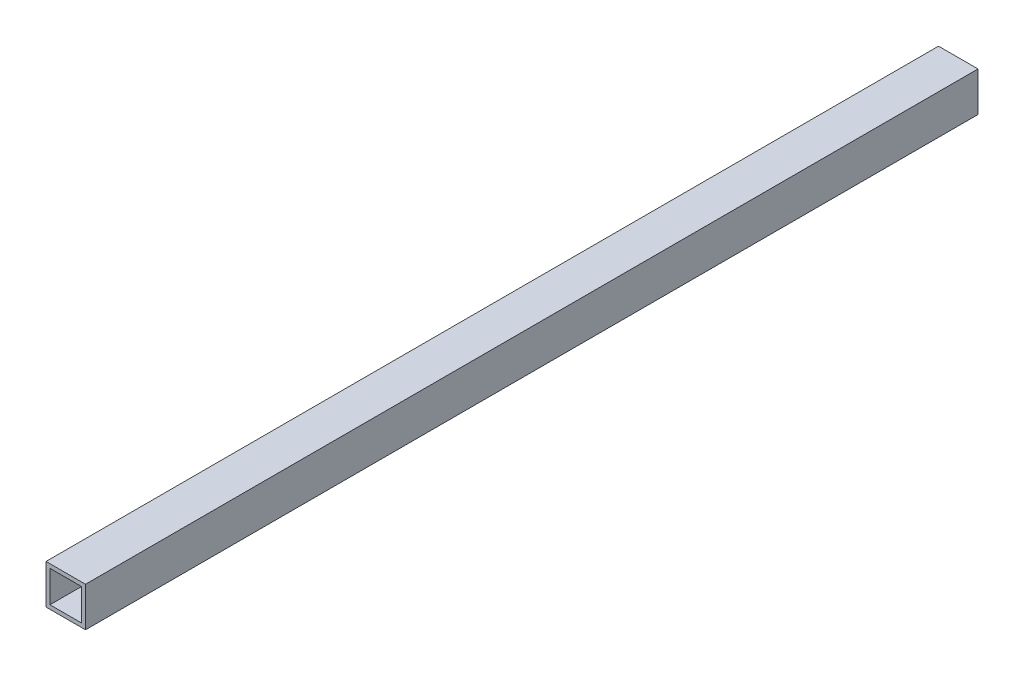
ISO-10303-21;
HEADER;
FILE_DESCRIPTION(('STEP AP214'),'2;1');
FILE_NAME('part.step','',(''),(''),'','','');
FILE_SCHEMA(('AUTOMOTIVE_DESIGN { 1 0 10303 214 1 1 1 1 }'));
ENDSEC;
DATA;
#1=APPLICATION_CONTEXT('core data for automotive mechanical design processes');
#2=APPLICATION_PROTOCOL_DEFINITION('international standard','automotive_design',2000,#1);
#3=PRODUCT_CONTEXT('',#1,'mechanical');
#4=PRODUCT('Part','Part','',(#3));
#5=PRODUCT_RELATED_PRODUCT_CATEGORY('part','',(#4));
#6=PRODUCT_DEFINITION_FORMATION('','',#4);
#7=PRODUCT_DEFINITION_CONTEXT('part definition',#1,'design');
#8=PRODUCT_DEFINITION('design','',#6,#7);
#9=PRODUCT_DEFINITION_SHAPE('','',#8);
#10=(LENGTH_UNIT() NAMED_UNIT(*) SI_UNIT(.MILLI.,.METRE.));
#11=(NAMED_UNIT(*) PLANE_ANGLE_UNIT() SI_UNIT($,.RADIAN.));
#12=(NAMED_UNIT(*) SI_UNIT($,.STERADIAN.) SOLID_ANGLE_UNIT());
#13=UNCERTAINTY_MEASURE_WITH_UNIT(LENGTH_MEASURE(1.E-05),#10,'distance_accuracy_value','');
#14=(GEOMETRIC_REPRESENTATION_CONTEXT(3) GLOBAL_UNCERTAINTY_ASSIGNED_CONTEXT((#13)) GLOBAL_UNIT_ASSIGNED_CONTEXT((#10,
#11,#12)) REPRESENTATION_CONTEXT('',''));
#15=CARTESIAN_POINT('',(0.,0.,0.));
#16=DIRECTION('',(0.,0.,1.));
#17=DIRECTION('',(1.,0.,0.));
#18=AXIS2_PLACEMENT_3D('',#15,#16,#17);
#19=CARTESIAN_POINT('',(0.,0.,226.));
#20=DIRECTION('',(0.,0.,1.));
#21=DIRECTION('',(1.,0.,0.));
#22=AXIS2_PLACEMENT_3D('',#19,#20,#21);
#23=PLANE('',#22);
#24=DIRECTION('',(0.,-1.,0.));
#25=VECTOR('',#24,1.);
#26=CARTESIAN_POINT('',(-10.,10.,226.));
#27=LINE('',#26,#25);
#28=CARTESIAN_POINT('',(-10.,10.,226.));
#29=VERTEX_POINT('',#28);
#30=CARTESIAN_POINT('',(-10.,-10.,226.));
#31=VERTEX_POINT('',#30);
#32=EDGE_CURVE('E161',#29,#31,#27,.T.);
#33=ORIENTED_EDGE('',*,*,#32,.T.);
#34=DIRECTION('',(1.,0.,0.));
#35=VECTOR('',#34,1.);
#36=CARTESIAN_POINT('',(-10.,-10.,226.));
#37=LINE('',#36,#35);
#38=CARTESIAN_POINT('',(10.,-10.,226.));
#39=VERTEX_POINT('',#38);
#40=EDGE_CURVE('E165',#31,#39,#37,.T.);
#41=ORIENTED_EDGE('',*,*,#40,.T.);
#42=DIRECTION('',(0.,1.,0.));
#43=VECTOR('',#42,1.);
#44=CARTESIAN_POINT('',(10.,10.,226.));
#45=LINE('',#44,#43);
#46=CARTESIAN_POINT('',(10.,10.,226.));
#47=VERTEX_POINT('',#46);
#48=EDGE_CURVE('E169',#39,#47,#45,.T.);
#49=ORIENTED_EDGE('',*,*,#48,.T.);
#50=DIRECTION('',(-1.,0.,0.));
#51=VECTOR('',#50,1.);
#52=CARTESIAN_POINT('',(-10.,10.,226.));
#53=LINE('',#52,#51);
#54=EDGE_CURVE('E172',#47,#29,#53,.T.);
#55=ORIENTED_EDGE('',*,*,#54,.T.);
#56=EDGE_LOOP('',(#33,#41,#49,#55));
#57=FACE_BOUND('',#56,.T.);
#58=DIRECTION('',(0.,-1.,0.));
#59=VECTOR('',#58,1.);
#60=CARTESIAN_POINT('',(-8.,8.,226.));
#61=LINE('',#60,#59);
#62=CARTESIAN_POINT('',(-8.,8.,226.));
#63=VERTEX_POINT('',#62);
#64=CARTESIAN_POINT('',(-8.,-8.,226.));
#65=VERTEX_POINT('',#64);
#66=EDGE_CURVE('E122',#63,#65,#61,.T.);
#67=ORIENTED_EDGE('',*,*,#66,.F.);
#68=DIRECTION('',(-1.,0.,0.));
#69=VECTOR('',#68,1.);
#70=CARTESIAN_POINT('',(-8.,8.,226.));
#71=LINE('',#70,#69);
#72=CARTESIAN_POINT('',(8.,8.,226.));
#73=VERTEX_POINT('',#72);
#74=EDGE_CURVE('E113',#73,#63,#71,.T.);
#75=ORIENTED_EDGE('',*,*,#74,.F.);
#76=DIRECTION('',(0.,1.,0.));
#77=VECTOR('',#76,1.);
#78=CARTESIAN_POINT('',(8.,8.,226.));
#79=LINE('',#78,#77);
#80=CARTESIAN_POINT('',(8.,-8.,226.));
#81=VERTEX_POINT('',#80);
#82=EDGE_CURVE('E139',#81,#73,#79,.T.);
#83=ORIENTED_EDGE('',*,*,#82,.F.);
#84=DIRECTION('',(1.,0.,0.));
#85=VECTOR('',#84,1.);
#86=CARTESIAN_POINT('',(-8.,-8.,226.));
#87=LINE('',#86,#85);
#88=EDGE_CURVE('E135',#65,#81,#87,.T.);
#89=ORIENTED_EDGE('',*,*,#88,.F.);
#90=EDGE_LOOP('',(#67,#75,#83,#89));
#91=FACE_BOUND('',#90,.T.);
#92=ADVANCED_FACE('F47',(#57,#91),#23,.T.);
#93=CARTESIAN_POINT('',(0.,0.,-226.));
#94=DIRECTION('',(0.,0.,1.));
#95=DIRECTION('',(1.,0.,0.));
#96=AXIS2_PLACEMENT_3D('',#93,#94,#95);
#97=PLANE('',#96);
#98=DIRECTION('',(0.,-1.,0.));
#99=VECTOR('',#98,1.);
#100=CARTESIAN_POINT('',(-10.,10.,-226.));
#101=LINE('',#100,#99);
#102=CARTESIAN_POINT('',(-10.,10.,-226.));
#103=VERTEX_POINT('',#102);
#104=CARTESIAN_POINT('',(-10.,-10.,-226.));
#105=VERTEX_POINT('',#104);
#106=EDGE_CURVE('E131',#103,#105,#101,.T.);
#107=ORIENTED_EDGE('',*,*,#106,.F.);
#108=DIRECTION('',(-1.,0.,0.));
#109=VECTOR('',#108,1.);
#110=CARTESIAN_POINT('',(-10.,10.,-226.));
#111=LINE('',#110,#109);
#112=CARTESIAN_POINT('',(10.,10.,-226.));
#113=VERTEX_POINT('',#112);
#114=EDGE_CURVE('E166',#113,#103,#111,.T.);
#115=ORIENTED_EDGE('',*,*,#114,.F.);
#116=DIRECTION('',(0.,1.,0.));
#117=VECTOR('',#116,1.);
#118=CARTESIAN_POINT('',(10.,10.,-226.));
#119=LINE('',#118,#117);
#120=CARTESIAN_POINT('',(10.,-10.,-226.));
#121=VERTEX_POINT('',#120);
#122=EDGE_CURVE('E182',#121,#113,#119,.T.);
#123=ORIENTED_EDGE('',*,*,#122,.F.);
#124=DIRECTION('',(1.,0.,0.));
#125=VECTOR('',#124,1.);
#126=CARTESIAN_POINT('',(-10.,-10.,-226.));
#127=LINE('',#126,#125);
#128=EDGE_CURVE('E179',#105,#121,#127,.T.);
#129=ORIENTED_EDGE('',*,*,#128,.F.);
#130=EDGE_LOOP('',(#107,#115,#123,#129));
#131=FACE_BOUND('',#130,.T.);
#132=DIRECTION('',(-1.,0.,0.));
#133=VECTOR('',#132,1.);
#134=CARTESIAN_POINT('',(-8.,8.,-226.));
#135=LINE('',#134,#133);
#136=CARTESIAN_POINT('',(8.,8.,-226.));
#137=VERTEX_POINT('',#136);
#138=CARTESIAN_POINT('',(-8.,8.,-226.));
#139=VERTEX_POINT('',#138);
#140=EDGE_CURVE('E71',#137,#139,#135,.T.);
#141=ORIENTED_EDGE('',*,*,#140,.T.);
#142=DIRECTION('',(0.,-1.,0.));
#143=VECTOR('',#142,1.);
#144=CARTESIAN_POINT('',(-8.,8.,-226.));
#145=LINE('',#144,#143);
#146=CARTESIAN_POINT('',(-8.,-8.,-226.));
#147=VERTEX_POINT('',#146);
#148=EDGE_CURVE('E129',#139,#147,#145,.T.);
#149=ORIENTED_EDGE('',*,*,#148,.T.);
#150=DIRECTION('',(1.,0.,0.));
#151=VECTOR('',#150,1.);
#152=CARTESIAN_POINT('',(-8.,-8.,-226.));
#153=LINE('',#152,#151);
#154=CARTESIAN_POINT('',(8.,-8.,-226.));
#155=VERTEX_POINT('',#154);
#156=EDGE_CURVE('E148',#147,#155,#153,.T.);
#157=ORIENTED_EDGE('',*,*,#156,.T.);
#158=DIRECTION('',(0.,1.,0.));
#159=VECTOR('',#158,1.);
#160=CARTESIAN_POINT('',(8.,8.,-226.));
#161=LINE('',#160,#159);
#162=EDGE_CURVE('E123',#155,#137,#161,.T.);
#163=ORIENTED_EDGE('',*,*,#162,.T.);
#164=EDGE_LOOP('',(#141,#149,#157,#163));
#165=FACE_BOUND('',#164,.T.);
#166=ADVANCED_FACE('F205',(#131,#165),#97,.F.);
#167=CARTESIAN_POINT('',(-10.,10.,226.));
#168=DIRECTION('',(1.,0.,0.));
#169=DIRECTION('',(0.,0.,-1.));
#170=AXIS2_PLACEMENT_3D('',#167,#168,#169);
#171=PLANE('',#170);
#172=ORIENTED_EDGE('',*,*,#106,.T.);
#173=DIRECTION('',(0.,0.,-1.));
#174=VECTOR('',#173,1.);
#175=CARTESIAN_POINT('',(-10.,-10.,226.));
#176=LINE('',#175,#174);
#177=EDGE_CURVE('E11',#31,#105,#176,.T.);
#178=ORIENTED_EDGE('',*,*,#177,.F.);
#179=ORIENTED_EDGE('',*,*,#32,.F.);
#180=DIRECTION('',(0.,0.,-1.));
#181=VECTOR('',#180,1.);
#182=CARTESIAN_POINT('',(-10.,10.,226.));
#183=LINE('',#182,#181);
#184=EDGE_CURVE('E175',#29,#103,#183,.T.);
#185=ORIENTED_EDGE('',*,*,#184,.T.);
#186=EDGE_LOOP('',(#172,#178,#179,#185));
#187=FACE_BOUND('',#186,.T.);
#188=ADVANCED_FACE('F49',(#187),#171,.F.);
#189=CARTESIAN_POINT('',(-10.,-10.,226.));
#190=DIRECTION('',(0.,1.,0.));
#191=DIRECTION('',(0.,0.,1.));
#192=AXIS2_PLACEMENT_3D('',#189,#190,#191);
#193=PLANE('',#192);
#194=ORIENTED_EDGE('',*,*,#128,.T.);
#195=DIRECTION('',(0.,0.,-1.));
#196=VECTOR('',#195,1.);
#197=CARTESIAN_POINT('',(10.,-10.,226.));
#198=LINE('',#197,#196);
#199=EDGE_CURVE('E56',#39,#121,#198,.T.);
#200=ORIENTED_EDGE('',*,*,#199,.F.);
#201=ORIENTED_EDGE('',*,*,#40,.F.);
#202=ORIENTED_EDGE('',*,*,#177,.T.);
#203=EDGE_LOOP('',(#194,#200,#201,#202));
#204=FACE_BOUND('',#203,.T.);
#205=ADVANCED_FACE('F215',(#204),#193,.F.);
#206=CARTESIAN_POINT('',(10.,10.,226.));
#207=DIRECTION('',(-1.,0.,0.));
#208=DIRECTION('',(0.,-1.,0.));
#209=AXIS2_PLACEMENT_3D('',#206,#207,#208);
#210=PLANE('',#209);
#211=ORIENTED_EDGE('',*,*,#122,.T.);
#212=DIRECTION('',(0.,0.,-1.));
#213=VECTOR('',#212,1.);
#214=CARTESIAN_POINT('',(10.,10.,226.));
#215=LINE('',#214,#213);
#216=EDGE_CURVE('E190',#47,#113,#215,.T.);
#217=ORIENTED_EDGE('',*,*,#216,.F.);
#218=ORIENTED_EDGE('',*,*,#48,.F.);
#219=ORIENTED_EDGE('',*,*,#199,.T.);
#220=EDGE_LOOP('',(#211,#217,#218,#219));
#221=FACE_BOUND('',#220,.T.);
#222=ADVANCED_FACE('F199',(#221),#210,.F.);
#223=CARTESIAN_POINT('',(-10.,10.,226.));
#224=DIRECTION('',(0.,-1.,0.));
#225=DIRECTION('',(0.,0.,-1.));
#226=AXIS2_PLACEMENT_3D('',#223,#224,#225);
#227=PLANE('',#226);
#228=ORIENTED_EDGE('',*,*,#114,.T.);
#229=ORIENTED_EDGE('',*,*,#184,.F.);
#230=ORIENTED_EDGE('',*,*,#54,.F.);
#231=ORIENTED_EDGE('',*,*,#216,.T.);
#232=EDGE_LOOP('',(#228,#229,#230,#231));
#233=FACE_BOUND('',#232,.T.);
#234=ADVANCED_FACE('F209',(#233),#227,.F.);
#235=CARTESIAN_POINT('',(-8.,8.,226.));
#236=DIRECTION('',(0.,-1.,0.));
#237=DIRECTION('',(0.,0.,-1.));
#238=AXIS2_PLACEMENT_3D('',#235,#236,#237);
#239=PLANE('',#238);
#240=ORIENTED_EDGE('',*,*,#140,.F.);
#241=DIRECTION('',(0.,0.,-1.));
#242=VECTOR('',#241,1.);
#243=CARTESIAN_POINT('',(8.,8.,226.));
#244=LINE('',#243,#242);
#245=EDGE_CURVE('E117',#73,#137,#244,.T.);
#246=ORIENTED_EDGE('',*,*,#245,.F.);
#247=ORIENTED_EDGE('',*,*,#74,.T.);
#248=DIRECTION('',(0.,0.,-1.));
#249=VECTOR('',#248,1.);
#250=CARTESIAN_POINT('',(-8.,8.,226.));
#251=LINE('',#250,#249);
#252=EDGE_CURVE('E116',#63,#139,#251,.T.);
#253=ORIENTED_EDGE('',*,*,#252,.T.);
#254=EDGE_LOOP('',(#240,#246,#247,#253));
#255=FACE_BOUND('',#254,.T.);
#256=ADVANCED_FACE('F115',(#255),#239,.T.);
#257=CARTESIAN_POINT('',(-8.,8.,226.));
#258=DIRECTION('',(1.,0.,0.));
#259=DIRECTION('',(0.,1.,0.));
#260=AXIS2_PLACEMENT_3D('',#257,#258,#259);
#261=PLANE('',#260);
#262=ORIENTED_EDGE('',*,*,#148,.F.);
#263=ORIENTED_EDGE('',*,*,#252,.F.);
#264=ORIENTED_EDGE('',*,*,#66,.T.);
#265=DIRECTION('',(0.,0.,-1.));
#266=VECTOR('',#265,1.);
#267=CARTESIAN_POINT('',(-8.,-8.,226.));
#268=LINE('',#267,#266);
#269=EDGE_CURVE('E132',#65,#147,#268,.T.);
#270=ORIENTED_EDGE('',*,*,#269,.T.);
#271=EDGE_LOOP('',(#262,#263,#264,#270));
#272=FACE_BOUND('',#271,.T.);
#273=ADVANCED_FACE('F126',(#272),#261,.T.);
#274=CARTESIAN_POINT('',(-8.,-8.,226.));
#275=DIRECTION('',(0.,1.,0.));
#276=DIRECTION('',(-1.,0.,0.));
#277=AXIS2_PLACEMENT_3D('',#274,#275,#276);
#278=PLANE('',#277);
#279=ORIENTED_EDGE('',*,*,#156,.F.);
#280=ORIENTED_EDGE('',*,*,#269,.F.);
#281=ORIENTED_EDGE('',*,*,#88,.T.);
#282=DIRECTION('',(0.,0.,-1.));
#283=VECTOR('',#282,1.);
#284=CARTESIAN_POINT('',(8.,-8.,226.));
#285=LINE('',#284,#283);
#286=EDGE_CURVE('E63',#81,#155,#285,.T.);
#287=ORIENTED_EDGE('',*,*,#286,.T.);
#288=EDGE_LOOP('',(#279,#280,#281,#287));
#289=FACE_BOUND('',#288,.T.);
#290=ADVANCED_FACE('F238',(#289),#278,.T.);
#291=CARTESIAN_POINT('',(8.,8.,226.));
#292=DIRECTION('',(-1.,0.,0.));
#293=DIRECTION('',(0.,-1.,0.));
#294=AXIS2_PLACEMENT_3D('',#291,#292,#293);
#295=PLANE('',#294);
#296=ORIENTED_EDGE('',*,*,#162,.F.);
#297=ORIENTED_EDGE('',*,*,#286,.F.);
#298=ORIENTED_EDGE('',*,*,#82,.T.);
#299=ORIENTED_EDGE('',*,*,#245,.T.);
#300=EDGE_LOOP('',(#296,#297,#298,#299));
#301=FACE_BOUND('',#300,.T.);
#302=ADVANCED_FACE('F242',(#301),#295,.T.);
#303=CLOSED_SHELL('',(#92,#166,#188,#205,#222,#234,#256,#273,#290,#302));
#304=MANIFOLD_SOLID_BREP('B2',#303);
#305=ADVANCED_BREP_SHAPE_REPRESENTATION('',(#18,#304),#14);
#306=SHAPE_DEFINITION_REPRESENTATION(#9,#305);
ENDSEC;
END-ISO-10303-21;
